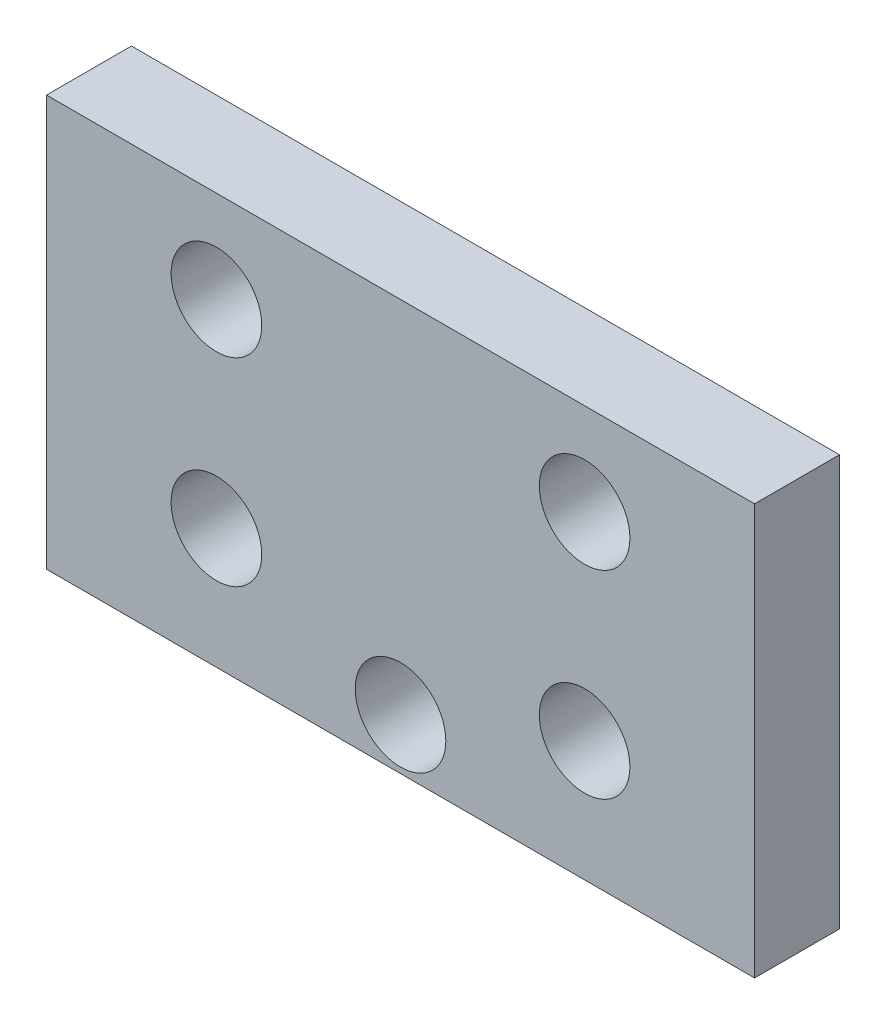
ISO-10303-21;
HEADER;
FILE_DESCRIPTION(('STEP AP214'),'2;1');
FILE_NAME('part.step','',(''),(''),'','','');
FILE_SCHEMA(('AUTOMOTIVE_DESIGN { 1 0 10303 214 1 1 1 1 }'));
ENDSEC;
DATA;
#1=APPLICATION_CONTEXT('core data for automotive mechanical design processes');
#2=APPLICATION_PROTOCOL_DEFINITION('international standard','automotive_design',2000,#1);
#3=PRODUCT_CONTEXT('',#1,'mechanical');
#4=PRODUCT('Part','Part','',(#3));
#5=PRODUCT_RELATED_PRODUCT_CATEGORY('part','',(#4));
#6=PRODUCT_DEFINITION_FORMATION('','',#4);
#7=PRODUCT_DEFINITION_CONTEXT('part definition',#1,'design');
#8=PRODUCT_DEFINITION('design','',#6,#7);
#9=PRODUCT_DEFINITION_SHAPE('','',#8);
#10=(LENGTH_UNIT() NAMED_UNIT(*) SI_UNIT(.MILLI.,.METRE.));
#11=(NAMED_UNIT(*) PLANE_ANGLE_UNIT() SI_UNIT($,.RADIAN.));
#12=(NAMED_UNIT(*) SI_UNIT($,.STERADIAN.) SOLID_ANGLE_UNIT());
#13=UNCERTAINTY_MEASURE_WITH_UNIT(LENGTH_MEASURE(1.E-05),#10,'distance_accuracy_value','');
#14=(GEOMETRIC_REPRESENTATION_CONTEXT(3) GLOBAL_UNCERTAINTY_ASSIGNED_CONTEXT((#13)) GLOBAL_UNIT_ASSIGNED_CONTEXT((#10,
#11,#12)) REPRESENTATION_CONTEXT('',''));
#15=CARTESIAN_POINT('',(0.,0.,0.));
#16=DIRECTION('',(0.,0.,1.));
#17=DIRECTION('',(1.,0.,0.));
#18=AXIS2_PLACEMENT_3D('',#15,#16,#17);
#19=CARTESIAN_POINT('',(0.,0.,3.));
#20=DIRECTION('',(0.,0.,1.));
#21=DIRECTION('',(1.,0.,0.));
#22=AXIS2_PLACEMENT_3D('',#19,#20,#21);
#23=PLANE('',#22);
#24=CARTESIAN_POINT('',(0.,-5.45,3.));
#25=DIRECTION('',(0.,0.,1.));
#26=DIRECTION('',(1.,0.,0.));
#27=AXIS2_PLACEMENT_3D('',#24,#25,#26);
#28=CIRCLE('',#27,1.6);
#29=CARTESIAN_POINT('',(1.6,-5.45,3.));
#30=VERTEX_POINT('',#29);
#31=EDGE_CURVE('E128',#30,#30,#28,.T.);
#32=ORIENTED_EDGE('',*,*,#31,.F.);
#33=EDGE_LOOP('',(#32));
#34=FACE_BOUND('',#33,.T.);
#35=CARTESIAN_POINT('',(6.5,4.,3.));
#36=DIRECTION('',(0.,0.,1.));
#37=DIRECTION('',(1.,0.,0.));
#38=AXIS2_PLACEMENT_3D('',#35,#36,#37);
#39=CIRCLE('',#38,1.6);
#40=CARTESIAN_POINT('',(8.1,4.,3.));
#41=VERTEX_POINT('',#40);
#42=EDGE_CURVE('E116',#41,#41,#39,.T.);
#43=ORIENTED_EDGE('',*,*,#42,.F.);
#44=EDGE_LOOP('',(#43));
#45=FACE_BOUND('',#44,.T.);
#46=DIRECTION('',(0.,-1.,0.));
#47=VECTOR('',#46,1.);
#48=CARTESIAN_POINT('',(-12.5,-7.25,3.));
#49=LINE('',#48,#47);
#50=CARTESIAN_POINT('',(-12.5,7.25,3.));
#51=VERTEX_POINT('',#50);
#52=CARTESIAN_POINT('',(-12.5,-7.25,3.));
#53=VERTEX_POINT('',#52);
#54=EDGE_CURVE('E86',#51,#53,#49,.T.);
#55=ORIENTED_EDGE('',*,*,#54,.T.);
#56=DIRECTION('',(1.,0.,0.));
#57=VECTOR('',#56,1.);
#58=CARTESIAN_POINT('',(12.5,-7.25,3.));
#59=LINE('',#58,#57);
#60=CARTESIAN_POINT('',(12.5,-7.25,3.));
#61=VERTEX_POINT('',#60);
#62=EDGE_CURVE('E81',#53,#61,#59,.T.);
#63=ORIENTED_EDGE('',*,*,#62,.T.);
#64=DIRECTION('',(0.,1.,0.));
#65=VECTOR('',#64,1.);
#66=CARTESIAN_POINT('',(12.5,-7.25,3.));
#67=LINE('',#66,#65);
#68=CARTESIAN_POINT('',(12.5,7.25,3.));
#69=VERTEX_POINT('',#68);
#70=EDGE_CURVE('E84',#61,#69,#67,.T.);
#71=ORIENTED_EDGE('',*,*,#70,.T.);
#72=DIRECTION('',(-1.,0.,0.));
#73=VECTOR('',#72,1.);
#74=CARTESIAN_POINT('',(12.5,7.25,3.));
#75=LINE('',#74,#73);
#76=EDGE_CURVE('E51',#69,#51,#75,.T.);
#77=ORIENTED_EDGE('',*,*,#76,.T.);
#78=EDGE_LOOP('',(#55,#63,#71,#77));
#79=FACE_BOUND('',#78,.T.);
#80=CARTESIAN_POINT('',(-6.5,4.,3.));
#81=DIRECTION('',(0.,0.,1.));
#82=DIRECTION('',(1.,0.,0.));
#83=AXIS2_PLACEMENT_3D('',#80,#81,#82);
#84=CIRCLE('',#83,1.6);
#85=CARTESIAN_POINT('',(-4.9,4.,3.));
#86=VERTEX_POINT('',#85);
#87=EDGE_CURVE('E101',#86,#86,#84,.T.);
#88=ORIENTED_EDGE('',*,*,#87,.F.);
#89=EDGE_LOOP('',(#88));
#90=FACE_BOUND('',#89,.T.);
#91=CARTESIAN_POINT('',(6.5,-3.,3.));
#92=DIRECTION('',(0.,0.,1.));
#93=DIRECTION('',(1.,0.,0.));
#94=AXIS2_PLACEMENT_3D('',#91,#92,#93);
#95=CIRCLE('',#94,1.6);
#96=CARTESIAN_POINT('',(8.1,-3.,3.));
#97=VERTEX_POINT('',#96);
#98=EDGE_CURVE('E122',#97,#97,#95,.T.);
#99=ORIENTED_EDGE('',*,*,#98,.F.);
#100=EDGE_LOOP('',(#99));
#101=FACE_BOUND('',#100,.T.);
#102=CARTESIAN_POINT('',(-6.5,-3.,3.));
#103=DIRECTION('',(0.,0.,1.));
#104=DIRECTION('',(1.,0.,0.));
#105=AXIS2_PLACEMENT_3D('',#102,#103,#104);
#106=CIRCLE('',#105,1.6);
#107=CARTESIAN_POINT('',(-4.9,-3.,3.));
#108=VERTEX_POINT('',#107);
#109=EDGE_CURVE('E134',#108,#108,#106,.T.);
#110=ORIENTED_EDGE('',*,*,#109,.F.);
#111=EDGE_LOOP('',(#110));
#112=FACE_BOUND('',#111,.T.);
#113=ADVANCED_FACE('F34',(#34,#45,#79,#90,#101,#112),#23,.T.);
#114=CARTESIAN_POINT('',(0.,0.,0.));
#115=DIRECTION('',(0.,0.,1.));
#116=DIRECTION('',(1.,0.,0.));
#117=AXIS2_PLACEMENT_3D('',#114,#115,#116);
#118=PLANE('',#117);
#119=DIRECTION('',(0.,-1.,0.));
#120=VECTOR('',#119,1.);
#121=CARTESIAN_POINT('',(-12.5,-7.25,0.));
#122=LINE('',#121,#120);
#123=CARTESIAN_POINT('',(-12.5,7.25,0.));
#124=VERTEX_POINT('',#123);
#125=CARTESIAN_POINT('',(-12.5,-7.25,0.));
#126=VERTEX_POINT('',#125);
#127=EDGE_CURVE('E98',#124,#126,#122,.T.);
#128=ORIENTED_EDGE('',*,*,#127,.F.);
#129=DIRECTION('',(-1.,0.,0.));
#130=VECTOR('',#129,1.);
#131=CARTESIAN_POINT('',(12.5,7.25,0.));
#132=LINE('',#131,#130);
#133=CARTESIAN_POINT('',(12.5,7.25,0.));
#134=VERTEX_POINT('',#133);
#135=EDGE_CURVE('E74',#134,#124,#132,.T.);
#136=ORIENTED_EDGE('',*,*,#135,.F.);
#137=DIRECTION('',(0.,1.,0.));
#138=VECTOR('',#137,1.);
#139=CARTESIAN_POINT('',(12.5,-7.25,0.));
#140=LINE('',#139,#138);
#141=CARTESIAN_POINT('',(12.5,-7.25,0.));
#142=VERTEX_POINT('',#141);
#143=EDGE_CURVE('E68',#142,#134,#140,.T.);
#144=ORIENTED_EDGE('',*,*,#143,.F.);
#145=DIRECTION('',(1.,0.,0.));
#146=VECTOR('',#145,1.);
#147=CARTESIAN_POINT('',(12.5,-7.25,0.));
#148=LINE('',#147,#146);
#149=EDGE_CURVE('E90',#126,#142,#148,.T.);
#150=ORIENTED_EDGE('',*,*,#149,.F.);
#151=EDGE_LOOP('',(#128,#136,#144,#150));
#152=FACE_BOUND('',#151,.T.);
#153=CARTESIAN_POINT('',(-6.5,4.,0.));
#154=DIRECTION('',(0.,0.,1.));
#155=DIRECTION('',(1.,0.,0.));
#156=AXIS2_PLACEMENT_3D('',#153,#154,#155);
#157=CIRCLE('',#156,1.6);
#158=CARTESIAN_POINT('',(-4.9,4.,0.));
#159=VERTEX_POINT('',#158);
#160=EDGE_CURVE('E113',#159,#159,#157,.T.);
#161=ORIENTED_EDGE('',*,*,#160,.T.);
#162=EDGE_LOOP('',(#161));
#163=FACE_BOUND('',#162,.T.);
#164=CARTESIAN_POINT('',(6.5,4.,0.));
#165=DIRECTION('',(0.,0.,1.));
#166=DIRECTION('',(1.,0.,0.));
#167=AXIS2_PLACEMENT_3D('',#164,#165,#166);
#168=CIRCLE('',#167,1.6);
#169=CARTESIAN_POINT('',(8.1,4.,0.));
#170=VERTEX_POINT('',#169);
#171=EDGE_CURVE('E119',#170,#170,#168,.T.);
#172=ORIENTED_EDGE('',*,*,#171,.T.);
#173=EDGE_LOOP('',(#172));
#174=FACE_BOUND('',#173,.T.);
#175=CARTESIAN_POINT('',(6.5,-3.,0.));
#176=DIRECTION('',(0.,0.,1.));
#177=DIRECTION('',(1.,0.,0.));
#178=AXIS2_PLACEMENT_3D('',#175,#176,#177);
#179=CIRCLE('',#178,1.6);
#180=CARTESIAN_POINT('',(8.1,-3.,0.));
#181=VERTEX_POINT('',#180);
#182=EDGE_CURVE('E125',#181,#181,#179,.T.);
#183=ORIENTED_EDGE('',*,*,#182,.T.);
#184=EDGE_LOOP('',(#183));
#185=FACE_BOUND('',#184,.T.);
#186=CARTESIAN_POINT('',(0.,-5.45,0.));
#187=DIRECTION('',(0.,0.,1.));
#188=DIRECTION('',(1.,0.,0.));
#189=AXIS2_PLACEMENT_3D('',#186,#187,#188);
#190=CIRCLE('',#189,1.6);
#191=CARTESIAN_POINT('',(1.6,-5.45,0.));
#192=VERTEX_POINT('',#191);
#193=EDGE_CURVE('E131',#192,#192,#190,.T.);
#194=ORIENTED_EDGE('',*,*,#193,.T.);
#195=EDGE_LOOP('',(#194));
#196=FACE_BOUND('',#195,.T.);
#197=CARTESIAN_POINT('',(-6.5,-3.,0.));
#198=DIRECTION('',(0.,0.,1.));
#199=DIRECTION('',(1.,0.,0.));
#200=AXIS2_PLACEMENT_3D('',#197,#198,#199);
#201=CIRCLE('',#200,1.6);
#202=CARTESIAN_POINT('',(-4.9,-3.,0.));
#203=VERTEX_POINT('',#202);
#204=EDGE_CURVE('E137',#203,#203,#201,.T.);
#205=ORIENTED_EDGE('',*,*,#204,.T.);
#206=EDGE_LOOP('',(#205));
#207=FACE_BOUND('',#206,.T.);
#208=ADVANCED_FACE('F109',(#152,#163,#174,#185,#196,#207),#118,.F.);
#209=CARTESIAN_POINT('',(-12.5,-7.25,3.));
#210=DIRECTION('',(1.,0.,0.));
#211=DIRECTION('',(0.,1.,0.));
#212=AXIS2_PLACEMENT_3D('',#209,#210,#211);
#213=PLANE('',#212);
#214=ORIENTED_EDGE('',*,*,#127,.T.);
#215=DIRECTION('',(0.,0.,-1.));
#216=VECTOR('',#215,1.);
#217=CARTESIAN_POINT('',(-12.5,-7.25,3.));
#218=LINE('',#217,#216);
#219=EDGE_CURVE('E11',#53,#126,#218,.T.);
#220=ORIENTED_EDGE('',*,*,#219,.F.);
#221=ORIENTED_EDGE('',*,*,#54,.F.);
#222=DIRECTION('',(0.,0.,-1.));
#223=VECTOR('',#222,1.);
#224=CARTESIAN_POINT('',(-12.5,7.25,3.));
#225=LINE('',#224,#223);
#226=EDGE_CURVE('E94',#51,#124,#225,.T.);
#227=ORIENTED_EDGE('',*,*,#226,.T.);
#228=EDGE_LOOP('',(#214,#220,#221,#227));
#229=FACE_BOUND('',#228,.T.);
#230=ADVANCED_FACE('F36',(#229),#213,.F.);
#231=CARTESIAN_POINT('',(12.5,-7.25,3.));
#232=DIRECTION('',(0.,1.,0.));
#233=DIRECTION('',(-1.,0.,0.));
#234=AXIS2_PLACEMENT_3D('',#231,#232,#233);
#235=PLANE('',#234);
#236=ORIENTED_EDGE('',*,*,#149,.T.);
#237=DIRECTION('',(0.,0.,-1.));
#238=VECTOR('',#237,1.);
#239=CARTESIAN_POINT('',(12.5,-7.25,3.));
#240=LINE('',#239,#238);
#241=EDGE_CURVE('E43',#61,#142,#240,.T.);
#242=ORIENTED_EDGE('',*,*,#241,.F.);
#243=ORIENTED_EDGE('',*,*,#62,.F.);
#244=ORIENTED_EDGE('',*,*,#219,.T.);
#245=EDGE_LOOP('',(#236,#242,#243,#244));
#246=FACE_BOUND('',#245,.T.);
#247=ADVANCED_FACE('F89',(#246),#235,.F.);
#248=CARTESIAN_POINT('',(12.5,-7.25,3.));
#249=DIRECTION('',(-1.,0.,0.));
#250=DIRECTION('',(0.,0.,1.));
#251=AXIS2_PLACEMENT_3D('',#248,#249,#250);
#252=PLANE('',#251);
#253=ORIENTED_EDGE('',*,*,#143,.T.);
#254=DIRECTION('',(0.,0.,-1.));
#255=VECTOR('',#254,1.);
#256=CARTESIAN_POINT('',(12.5,7.25,3.));
#257=LINE('',#256,#255);
#258=EDGE_CURVE('E91',#69,#134,#257,.T.);
#259=ORIENTED_EDGE('',*,*,#258,.F.);
#260=ORIENTED_EDGE('',*,*,#70,.F.);
#261=ORIENTED_EDGE('',*,*,#241,.T.);
#262=EDGE_LOOP('',(#253,#259,#260,#261));
#263=FACE_BOUND('',#262,.T.);
#264=ADVANCED_FACE('F92',(#263),#252,.F.);
#265=CARTESIAN_POINT('',(12.5,7.25,3.));
#266=DIRECTION('',(0.,-1.,0.));
#267=DIRECTION('',(1.,0.,0.));
#268=AXIS2_PLACEMENT_3D('',#265,#266,#267);
#269=PLANE('',#268);
#270=ORIENTED_EDGE('',*,*,#135,.T.);
#271=ORIENTED_EDGE('',*,*,#226,.F.);
#272=ORIENTED_EDGE('',*,*,#76,.F.);
#273=ORIENTED_EDGE('',*,*,#258,.T.);
#274=EDGE_LOOP('',(#270,#271,#272,#273));
#275=FACE_BOUND('',#274,.T.);
#276=ADVANCED_FACE('F106',(#275),#269,.F.);
#277=CARTESIAN_POINT('',(-6.5,4.,3.));
#278=DIRECTION('',(0.,0.,-1.));
#279=DIRECTION('',(-1.,0.,0.));
#280=AXIS2_PLACEMENT_3D('',#277,#278,#279);
#281=CYLINDRICAL_SURFACE('',#280,1.6);
#282=ORIENTED_EDGE('',*,*,#87,.T.);
#283=EDGE_LOOP('',(#282));
#284=FACE_BOUND('',#283,.T.);
#285=ORIENTED_EDGE('',*,*,#160,.F.);
#286=EDGE_LOOP('',(#285));
#287=FACE_BOUND('',#286,.T.);
#288=ADVANCED_FACE('F156',(#284,#287),#281,.F.);
#289=CARTESIAN_POINT('',(6.5,4.,3.));
#290=DIRECTION('',(0.,0.,-1.));
#291=DIRECTION('',(-1.,0.,0.));
#292=AXIS2_PLACEMENT_3D('',#289,#290,#291);
#293=CYLINDRICAL_SURFACE('',#292,1.6);
#294=ORIENTED_EDGE('',*,*,#42,.T.);
#295=EDGE_LOOP('',(#294));
#296=FACE_BOUND('',#295,.T.);
#297=ORIENTED_EDGE('',*,*,#171,.F.);
#298=EDGE_LOOP('',(#297));
#299=FACE_BOUND('',#298,.T.);
#300=ADVANCED_FACE('F202',(#296,#299),#293,.F.);
#301=CARTESIAN_POINT('',(6.5,-3.,3.));
#302=DIRECTION('',(0.,0.,-1.));
#303=DIRECTION('',(-1.,0.,0.));
#304=AXIS2_PLACEMENT_3D('',#301,#302,#303);
#305=CYLINDRICAL_SURFACE('',#304,1.6);
#306=ORIENTED_EDGE('',*,*,#98,.T.);
#307=EDGE_LOOP('',(#306));
#308=FACE_BOUND('',#307,.T.);
#309=ORIENTED_EDGE('',*,*,#182,.F.);
#310=EDGE_LOOP('',(#309));
#311=FACE_BOUND('',#310,.T.);
#312=ADVANCED_FACE('F210',(#308,#311),#305,.F.);
#313=CARTESIAN_POINT('',(0.,-5.45,3.));
#314=DIRECTION('',(0.,0.,-1.));
#315=DIRECTION('',(-1.,0.,0.));
#316=AXIS2_PLACEMENT_3D('',#313,#314,#315);
#317=CYLINDRICAL_SURFACE('',#316,1.6);
#318=ORIENTED_EDGE('',*,*,#31,.T.);
#319=EDGE_LOOP('',(#318));
#320=FACE_BOUND('',#319,.T.);
#321=ORIENTED_EDGE('',*,*,#193,.F.);
#322=EDGE_LOOP('',(#321));
#323=FACE_BOUND('',#322,.T.);
#324=ADVANCED_FACE('F218',(#320,#323),#317,.F.);
#325=CARTESIAN_POINT('',(-6.5,-3.,3.));
#326=DIRECTION('',(0.,0.,-1.));
#327=DIRECTION('',(-1.,0.,0.));
#328=AXIS2_PLACEMENT_3D('',#325,#326,#327);
#329=CYLINDRICAL_SURFACE('',#328,1.6);
#330=ORIENTED_EDGE('',*,*,#109,.T.);
#331=EDGE_LOOP('',(#330));
#332=FACE_BOUND('',#331,.T.);
#333=ORIENTED_EDGE('',*,*,#204,.F.);
#334=EDGE_LOOP('',(#333));
#335=FACE_BOUND('',#334,.T.);
#336=ADVANCED_FACE('F143',(#332,#335),#329,.F.);
#337=CLOSED_SHELL('',(#113,#208,#230,#247,#264,#276,#288,#300,#312,#324,#336));
#338=MANIFOLD_SOLID_BREP('B2',#337);
#339=ADVANCED_BREP_SHAPE_REPRESENTATION('',(#18,#338),#14);
#340=SHAPE_DEFINITION_REPRESENTATION(#9,#339);
ENDSEC;
END-ISO-10303-21;
